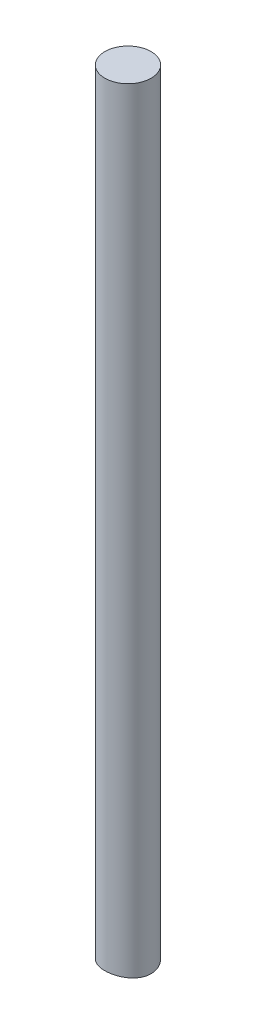
ISO-10303-21;
HEADER;
FILE_DESCRIPTION(('STEP AP214'),'2;1');
FILE_NAME('part.step','',(''),(''),'','','');
FILE_SCHEMA(('AUTOMOTIVE_DESIGN { 1 0 10303 214 1 1 1 1 }'));
ENDSEC;
DATA;
#1=APPLICATION_CONTEXT('core data for automotive mechanical design processes');
#2=APPLICATION_PROTOCOL_DEFINITION('international standard','automotive_design',2000,#1);
#3=PRODUCT_CONTEXT('',#1,'mechanical');
#4=PRODUCT('Part','Part','',(#3));
#5=PRODUCT_RELATED_PRODUCT_CATEGORY('part','',(#4));
#6=PRODUCT_DEFINITION_FORMATION('','',#4);
#7=PRODUCT_DEFINITION_CONTEXT('part definition',#1,'design');
#8=PRODUCT_DEFINITION('design','',#6,#7);
#9=PRODUCT_DEFINITION_SHAPE('','',#8);
#10=(LENGTH_UNIT() NAMED_UNIT(*) SI_UNIT(.MILLI.,.METRE.));
#11=(NAMED_UNIT(*) PLANE_ANGLE_UNIT() SI_UNIT($,.RADIAN.));
#12=(NAMED_UNIT(*) SI_UNIT($,.STERADIAN.) SOLID_ANGLE_UNIT());
#13=UNCERTAINTY_MEASURE_WITH_UNIT(LENGTH_MEASURE(1.E-05),#10,'distance_accuracy_value','');
#14=(GEOMETRIC_REPRESENTATION_CONTEXT(3) GLOBAL_UNCERTAINTY_ASSIGNED_CONTEXT((#13)) GLOBAL_UNIT_ASSIGNED_CONTEXT((#10,
#11,#12)) REPRESENTATION_CONTEXT('',''));
#15=CARTESIAN_POINT('',(0.,0.,0.));
#16=DIRECTION('',(0.,0.,1.));
#17=DIRECTION('',(1.,0.,0.));
#18=AXIS2_PLACEMENT_3D('',#15,#16,#17);
#19=CARTESIAN_POINT('',(0.,150.95,0.));
#20=DIRECTION('',(0.,1.,0.));
#21=DIRECTION('',(0.,0.,1.));
#22=AXIS2_PLACEMENT_3D('',#19,#20,#21);
#23=PLANE('',#22);
#24=CARTESIAN_POINT('',(0.,150.95,0.));
#25=DIRECTION('',(0.,1.,0.));
#26=DIRECTION('',(0.,0.,1.));
#27=AXIS2_PLACEMENT_3D('',#24,#25,#26);
#28=CIRCLE('',#27,9.);
#29=CARTESIAN_POINT('',(0.,150.95,9.));
#30=VERTEX_POINT('',#29);
#31=EDGE_CURVE('E47',#30,#30,#28,.T.);
#32=ORIENTED_EDGE('',*,*,#31,.T.);
#33=EDGE_LOOP('',(#32));
#34=FACE_BOUND('',#33,.T.);
#35=ADVANCED_FACE('F37',(#34),#23,.T.);
#36=CARTESIAN_POINT('',(0.,150.95,0.));
#37=DIRECTION('',(0.,-1.,0.));
#38=DIRECTION('',(1.,0.,0.));
#39=AXIS2_PLACEMENT_3D('',#36,#37,#38);
#40=CYLINDRICAL_SURFACE('',#39,9.);
#41=CARTESIAN_POINT('',(9.00000000000001,-150.95,0.));
#42=CARTESIAN_POINT('',(9.00000597090946,-150.950003596504,-0.249478747051511));
#43=CARTESIAN_POINT('',(8.98962445699642,-150.947631874361,-0.498887224844237));
#44=CARTESIAN_POINT('',(8.94819627684323,-150.93822419597,-0.995966383017526));
#45=CARTESIAN_POINT('',(8.91714658186356,-150.93118755612,-1.2436368033249));
#46=CARTESIAN_POINT('',(8.83461030781545,-150.912651827956,-1.73547839362825));
#47=CARTESIAN_POINT('',(8.78311479398731,-150.901150788762,-1.97964798537555));
#48=CARTESIAN_POINT('',(8.66008253150412,-150.874023854677,-2.46274630928631));
#49=CARTESIAN_POINT('',(8.58853838574185,-150.858396437448,-2.70167307191331));
#50=CARTESIAN_POINT('',(8.42610088324857,-150.823502707337,-3.17217155298973));
#51=CARTESIAN_POINT('',(8.33523691219093,-150.804241925807,-3.40375383455452));
#52=CARTESIAN_POINT('',(8.13474397326102,-150.762612048801,-3.85845861359894));
#53=CARTESIAN_POINT('',(8.0251079822317,-150.740241790571,-4.08157790652689));
#54=CARTESIAN_POINT('',(7.78794411574883,-150.693041583485,-4.51768853649975));
#55=CARTESIAN_POINT('',(7.66042430127341,-150.668212744288,-4.7306843790063));
#56=CARTESIAN_POINT('',(7.38828480984744,-150.616765245803,-5.14536514007311));
#57=CARTESIAN_POINT('',(7.24365733069631,-150.590145772276,-5.34704483543979));
#58=CARTESIAN_POINT('',(6.93593190217545,-150.535430911675,-5.74075315289778));
#59=CARTESIAN_POINT('',(6.77258011331436,-150.507318937086,-5.9325811117142));
#60=CARTESIAN_POINT('',(6.4304758592885,-150.450809307291,-6.3017686051796));
#61=CARTESIAN_POINT('',(6.25173013669446,-150.422411781922,-6.47913440867295));
#62=CARTESIAN_POINT('',(5.87987593476136,-150.36609140498,-6.81838920067573));
#63=CARTESIAN_POINT('',(5.6867604636943,-150.338168792705,-6.98027056638653));
#64=CARTESIAN_POINT('',(5.28760023928098,-150.283594037415,-7.28729429836205));
#65=CARTESIAN_POINT('',(5.08156037208774,-150.256941420896,-7.43244293235203));
#66=CARTESIAN_POINT('',(4.65546180962888,-150.20534138418,-7.70659293723849));
#67=CARTESIAN_POINT('',(4.4352711285588,-150.180416606971,-7.83539355422586));
#68=CARTESIAN_POINT('',(3.98460509889337,-150.133323144549,-8.07390197777268));
#69=CARTESIAN_POINT('',(3.75413371117661,-150.111153410145,-8.18361705899877));
#70=CARTESIAN_POINT('',(3.28442160926389,-150.070188861268,-8.38317922159496));
#71=CARTESIAN_POINT('',(3.04517996602474,-150.051394405594,-8.47302419097034));
#72=CARTESIAN_POINT('',(2.55967334230449,-150.017724172587,-8.63211010818758));
#73=CARTESIAN_POINT('',(2.31340848945551,-150.002848324093,-8.70135143019644));
#74=CARTESIAN_POINT('',(1.81968712483875,-149.977651403359,-8.81771069252452));
#75=CARTESIAN_POINT('',(1.5723141028917,-149.967260645597,-8.86516789427816));
#76=CARTESIAN_POINT('',(1.07431516357684,-149.950982782689,-8.93919543401638));
#77=CARTESIAN_POINT('',(0.823689277842448,-149.94509563378,-8.96576597496488));
#78=CARTESIAN_POINT('',(0.321051948043322,-149.937992611184,-8.99779624210098));
#79=CARTESIAN_POINT('',(0.069040649413968,-149.936776256211,-9.00325814336025));
#80=CARTESIAN_POINT('',(-0.434529751221886,-149.93904820275,-8.9930308551108));
#81=CARTESIAN_POINT('',(-0.686088857588583,-149.942536458653,-8.97734187065366));
#82=CARTESIAN_POINT('',(-1.18244611102007,-149.954014955482,-8.9254120228847));
#83=CARTESIAN_POINT('',(-1.42728496816257,-149.961924101813,-8.88954128787808));
#84=CARTESIAN_POINT('',(-1.91310027083867,-149.981972181065,-8.79779391171789));
#85=CARTESIAN_POINT('',(-2.15407528351104,-149.994112646835,-8.74191002034936));
#86=CARTESIAN_POINT('',(-2.63035576524861,-150.022290069787,-8.61058892192459));
#87=CARTESIAN_POINT('',(-2.86566220443983,-150.038326354953,-8.53515508702657));
#88=CARTESIAN_POINT('',(-3.32905682816045,-150.073864222184,-8.36530218807001));
#89=CARTESIAN_POINT('',(-3.55714472919934,-150.093365940148,-8.27088237945177));
#90=CARTESIAN_POINT('',(-4.00624759133883,-150.135468959614,-8.06298121741445));
#91=CARTESIAN_POINT('',(-4.22719700966891,-150.158092321539,-7.94936277597877));
#92=CARTESIAN_POINT('',(-4.65876367238253,-150.205716388209,-7.70438127319895));
#93=CARTESIAN_POINT('',(-4.86938065513427,-150.230717153106,-7.57301776284052));
#94=CARTESIAN_POINT('',(-5.27893067317314,-150.282427897791,-7.29344708879395));
#95=CARTESIAN_POINT('',(-5.47786246840648,-150.309138058356,-7.14523814231754));
#96=CARTESIAN_POINT('',(-5.8627401375951,-150.363551035013,-6.83298536901697));
#97=CARTESIAN_POINT('',(-6.04868580704009,-150.391253866727,-6.66894129291223));
#98=CARTESIAN_POINT('',(-6.41024172335189,-150.447509126037,-6.32240786918142));
#99=CARTESIAN_POINT('',(-6.58554391548773,-150.476067016365,-6.1395978461078));
#100=CARTESIAN_POINT('',(-6.92015899212906,-150.532642649641,-5.75981344063984));
#101=CARTESIAN_POINT('',(-7.07947201309102,-150.560660397196,-5.56283917915208));
#102=CARTESIAN_POINT('',(-7.38102058676097,-150.615364204774,-5.15602987358781));
#103=CARTESIAN_POINT('',(-7.5232550780433,-150.642050181967,-4.94619403139071));
#104=CARTESIAN_POINT('',(-7.78961742209489,-150.693321675195,-4.51509212825182));
#105=CARTESIAN_POINT('',(-7.91374589219761,-150.717907262831,-4.29382645736401));
#106=CARTESIAN_POINT('',(-8.14337319413934,-150.764340498336,-3.84060206395316));
#107=CARTESIAN_POINT('',(-8.24880767323334,-150.786178616094,-3.60860974258192));
#108=CARTESIAN_POINT('',(-8.43967749672589,-150.826359264795,-3.13634857775796));
#109=CARTESIAN_POINT('',(-8.52512063432511,-150.844703157369,-2.89608300150075));
#110=CARTESIAN_POINT('',(-8.67537860959679,-150.877349948101,-2.40889821995185));
#111=CARTESIAN_POINT('',(-8.74019214882576,-150.891652591894,-2.16197859690964));
#112=CARTESIAN_POINT('',(-8.84864269444628,-150.91577377948,-1.66331732056395));
#113=CARTESIAN_POINT('',(-8.89228013016993,-150.925592414183,-1.41157576512967));
#114=CARTESIAN_POINT('',(-8.95731549563359,-150.940283375872,-0.910484684969951));
#115=CARTESIAN_POINT('',(-8.97916185342899,-150.94525538806,-0.661196203488105));
#116=CARTESIAN_POINT('',(-9.00202212027913,-150.950459094989,-0.161617811781478));
#117=CARTESIAN_POINT('',(-9.00303631985903,-150.950690855837,0.088672084428887));
#118=CARTESIAN_POINT('',(-8.98422476473957,-150.946407227698,0.588408911175563));
#119=CARTESIAN_POINT('',(-8.96440038956596,-150.941892152954,0.837855896416415));
#120=CARTESIAN_POINT('',(-8.90407939171556,-150.928251610844,1.3341087225253));
#121=CARTESIAN_POINT('',(-8.86358283067502,-150.919126157226,1.5809145712659));
#122=CARTESIAN_POINT('',(-8.762885186647,-150.896679905702,2.06704854792695));
#123=CARTESIAN_POINT('',(-8.70293681880864,-150.883412992756,2.30643158905471));
#124=CARTESIAN_POINT('',(-8.56365016991645,-150.853028075501,2.77933027807532));
#125=CARTESIAN_POINT('',(-8.48430485419596,-150.835908674194,3.0128437633035));
#126=CARTESIAN_POINT('',(-8.30686193153771,-150.798314582588,3.47227134584256));
#127=CARTESIAN_POINT('',(-8.20876985701746,-150.777840882439,3.69818766210576));
#128=CARTESIAN_POINT('',(-7.99449245439496,-150.734099612641,4.14109103416699));
#129=CARTESIAN_POINT('',(-7.87830024729222,-150.710830981544,4.35807465526901));
#130=CARTESIAN_POINT('',(-7.62673548114933,-150.661770873873,4.78489430619324));
#131=CARTESIAN_POINT('',(-7.49109461496371,-150.635946007627,4.99456837224539));
#132=CARTESIAN_POINT('',(-7.20290396108288,-150.582792472587,5.40189284595605));
#133=CARTESIAN_POINT('',(-7.05034654143825,-150.555463127865,5.59953776383925));
#134=CARTESIAN_POINT('',(-6.7293846006825,-150.500062288162,5.98143843213023));
#135=CARTESIAN_POINT('',(-6.56097827602408,-150.47199070898,6.16569265448761));
#136=CARTESIAN_POINT('',(-6.20952413328601,-150.415887888934,6.51950613088909));
#137=CARTESIAN_POINT('',(-6.0264827408108,-150.387856635807,6.68907176664312));
#138=CARTESIAN_POINT('',(-5.64313445892018,-150.332036411047,7.01567407348424));
#139=CARTESIAN_POINT('',(-5.44255801194158,-150.304263153247,7.1723972299214));
#140=CARTESIAN_POINT('',(-5.02878679441528,-150.25032893094,7.46833150724009));
#141=CARTESIAN_POINT('',(-4.81559675401767,-150.224167369458,7.6075491323243));
#142=CARTESIAN_POINT('',(-4.37790441549104,-150.174173779415,7.86757724046992));
#143=CARTESIAN_POINT('',(-4.15339811744906,-150.150342583433,7.98838115332949));
#144=CARTESIAN_POINT('',(-3.69479045296887,-150.105705163554,8.21056745992073));
#145=CARTESIAN_POINT('',(-3.46069292877148,-150.084897743233,8.31195754023858));
#146=CARTESIAN_POINT('',(-2.9859915282996,-150.047011625911,8.49400158580839));
#147=CARTESIAN_POINT('',(-2.74543846593027,-150.029910068903,8.57478325846762));
#148=CARTESIAN_POINT('',(-2.25813251375613,-149.99975522288,8.71580023230132));
#149=CARTESIAN_POINT('',(-2.01137963752685,-149.986701925002,8.7760355784612));
#150=CARTESIAN_POINT('',(-1.5135080926049,-149.965019072328,8.87545632708885));
#151=CARTESIAN_POINT('',(-1.26238997605839,-149.956388962206,8.91464437205187));
#152=CARTESIAN_POINT('',(-0.757624813670086,-149.943799090184,8.97165038816533));
#153=CARTESIAN_POINT('',(-0.503977810448509,-149.939839249708,8.98946871885532));
#154=CARTESIAN_POINT('',(-0.0015105437304215,-149.93673761529,9.00343296783099));
#155=CARTESIAN_POINT('',(0.247296514992394,-149.937494269534,9.00003568097088));
#156=CARTESIAN_POINT('',(0.74371709324448,-149.943567416722,8.97266283729122));
#157=CARTESIAN_POINT('',(0.991330630955277,-149.948883839982,8.94868759494899));
#158=CARTESIAN_POINT('',(1.48358519983645,-149.963929078867,8.88035589119304));
#159=CARTESIAN_POINT('',(1.72822630330239,-149.973657786955,8.83599992650205));
#160=CARTESIAN_POINT('',(2.21281197476808,-149.997259403704,8.72726336056371));
#161=CARTESIAN_POINT('',(2.45275652290267,-150.01113232989,8.6628826746367));
#162=CARTESIAN_POINT('',(2.92541930180872,-150.042585241348,8.51487112486708));
#163=CARTESIAN_POINT('',(3.1581605941013,-150.060151592946,8.43131095772143));
#164=CARTESIAN_POINT('',(3.61583403942842,-150.098554578784,8.24540924481848));
#165=CARTESIAN_POINT('',(3.84076332274672,-150.11939239959,8.14306088226979));
#166=CARTESIAN_POINT('',(4.28120971173708,-150.163773285563,7.92036197926215));
#167=CARTESIAN_POINT('',(4.49672795663184,-150.187316022037,7.80001362558208));
#168=CARTESIAN_POINT('',(4.9169926177301,-150.236483956143,7.54214609683399));
#169=CARTESIAN_POINT('',(5.12173858194249,-150.262109241042,7.40462620208546));
#170=CARTESIAN_POINT('',(5.52302310790343,-150.315277944229,7.11050630229231));
#171=CARTESIAN_POINT('',(5.71932356835558,-150.342849033575,6.95358635571878));
#172=CARTESIAN_POINT('',(6.09806650370841,-150.398693812392,6.62394257574503));
#173=CARTESIAN_POINT('',(6.28050881226379,-150.426967510292,6.45121855269661));
#174=CARTESIAN_POINT('',(6.63037106463721,-150.483446164549,6.09107712264859));
#175=CARTESIAN_POINT('',(6.79778727325557,-150.511651102128,5.9036560838283));
#176=CARTESIAN_POINT('',(7.11641821693678,-150.56720248764,5.51540191482836));
#177=CARTESIAN_POINT('',(7.26763329796097,-150.594548953896,5.31456907119517));
#178=CARTESIAN_POINT('',(7.55484379006788,-150.647993053183,4.89788339926355));
#179=CARTESIAN_POINT('',(7.69059390020466,-150.674067574494,4.68185840946182));
#180=CARTESIAN_POINT('',(7.94332605860001,-150.723774588931,4.23893453325485));
#181=CARTESIAN_POINT('',(8.06031499687466,-150.747407977419,4.01203967873465));
#182=CARTESIAN_POINT('',(8.27464110495729,-150.791529556807,3.54899260460878));
#183=CARTESIAN_POINT('',(8.37198890917982,-150.812019448261,3.31284547767776));
#184=CARTESIAN_POINT('',(8.54632180453473,-150.849248034597,2.83294678870232));
#185=CARTESIAN_POINT('',(8.62331049279629,-150.865987392057,2.58919657852036));
#186=CARTESIAN_POINT('',(8.79247439273747,-150.90313848125,1.9615842179666));
#187=CARTESIAN_POINT('',(8.87017798585292,-150.920604942189,1.57354332599645));
#188=CARTESIAN_POINT('',(8.97393472170693,-150.944032555472,0.790275973859261));
#189=CARTESIAN_POINT('',(8.99999054505793,-150.949994304931,0.395049887691296));
#190=CARTESIAN_POINT('',(9.00000000000001,-150.95,0.));
#191=B_SPLINE_CURVE_WITH_KNOTS('',3,(#41,#42,#43,#44,#45,#46,#47,#48,#49,#50,#51,#52,#53,#54,
#55,#56,#57,#58,#59,#60,#61,#62,#63,#64,#65,#66,#67,#68,#69,#70,#71,#72,#73,#74,#75,#76,#77,#78,
#79,#80,#81,#82,#83,#84,#85,#86,#87,#88,#89,#90,#91,#92,#93,#94,#95,#96,#97,#98,#99,#100,#101,
#102,#103,#104,#105,#106,#107,#108,#109,#110,#111,#112,#113,#114,#115,#116,#117,#118,#119,#120,
#121,#122,#123,#124,#125,#126,#127,#128,#129,#130,#131,#132,#133,#134,#135,#136,#137,#138,#139,
#140,#141,#142,#143,#144,#145,#146,#147,#148,#149,#150,#151,#152,#153,#154,#155,#156,#157,#158,
#159,#160,#161,#162,#163,#164,#165,#166,#167,#168,#169,#170,#171,#172,#173,#174,#175,#176,#177,
#178,#179,#180,#181,#182,#183,#184,#185,#186,#187,#188,#189,#190),.UNSPECIFIED.,.T.,.F.,(4,2,2,
2,2,2,2,2,2,2,2,2,2,2,2,2,2,2,2,2,2,2,2,2,2,2,2,2,2,2,2,2,2,2,2,2,2,2,2,2,2,2,2,2,2,2,2,2,2,2,2,
2,2,2,2,2,2,2,2,2,2,2,2,2,2,2,2,2,2,2,2,2,2,2,4),(0.,0.748088283585328,1.49628621704731,
2.24481147119689,2.99361326432728,3.7412841663196,4.48923540734959,5.23685059296373,
5.98480806362957,6.74448175333514,7.5038243805731,8.26353891946315,9.02296795438104,
9.79096899095478,10.5586766508025,11.3264658711422,12.0942411474002,12.8496157520649,
13.6049830163658,14.3602724442088,15.1155545497966,15.8574164637185,16.5995474060896,
17.3415504238312,18.083582545865,18.8311562600306,19.5787488940541,20.3264207211943,
21.0741043202921,21.8378586200491,22.6016064011386,23.365401624389,24.1291707995855,
24.895520199352,25.6615703544418,26.4276687158133,27.193751544376,27.9437225105621,
28.69368301765,29.4435938800434,30.193502506514,30.9340343418063,31.674835144317,
32.4154176633197,33.1562823323435,33.9085793947951,34.6612172497296,35.4139408558949,
36.1663357706663,36.9335876048241,37.7005535178901,38.4677924548817,39.2347269852887,
39.9967866948233,40.7588447358458,41.5208070778633,42.2827565998946,43.0283579363624,
43.7739478785724,44.51951965009,45.2650945744918,46.007964188241,46.7511038668905,
47.4941533363771,48.2372339584444,48.994813934602,49.7524030028775,50.5101798746541,
51.2679405615213,52.0364105789136,52.8045977271719,53.5723678285622,54.3400021865208,
55.5246623459874,56.7092610178436),.UNSPECIFIED.);
#192=CARTESIAN_POINT('',(9.00000000000001,-150.95,0.));
#193=VERTEX_POINT('',#192);
#194=EDGE_CURVE('E11',#193,#193,#191,.T.);
#195=ORIENTED_EDGE('',*,*,#194,.T.);
#196=EDGE_LOOP('',(#195));
#197=FACE_BOUND('',#196,.T.);
#198=ORIENTED_EDGE('',*,*,#31,.F.);
#199=EDGE_LOOP('',(#198));
#200=FACE_BOUND('',#199,.T.);
#201=ADVANCED_FACE('F51',(#197,#200),#40,.T.);
#202=CARTESIAN_POINT('',(0.,-190.44375,-9.));
#203=DIRECTION('',(0.,0.,1.));
#204=DIRECTION('',(1.,0.,0.));
#205=AXIS2_PLACEMENT_3D('',#202,#203,#204);
#206=CYLINDRICAL_SURFACE('',#205,40.50625);
#207=ORIENTED_EDGE('',*,*,#194,.F.);
#208=EDGE_LOOP('',(#207));
#209=FACE_BOUND('',#208,.T.);
#210=ADVANCED_FACE('F54',(#209),#206,.F.);
#211=CLOSED_SHELL('',(#35,#201,#210));
#212=MANIFOLD_SOLID_BREP('B2',#211);
#213=ADVANCED_BREP_SHAPE_REPRESENTATION('',(#18,#212),#14);
#214=SHAPE_DEFINITION_REPRESENTATION(#9,#213);
ENDSEC;
END-ISO-10303-21;
